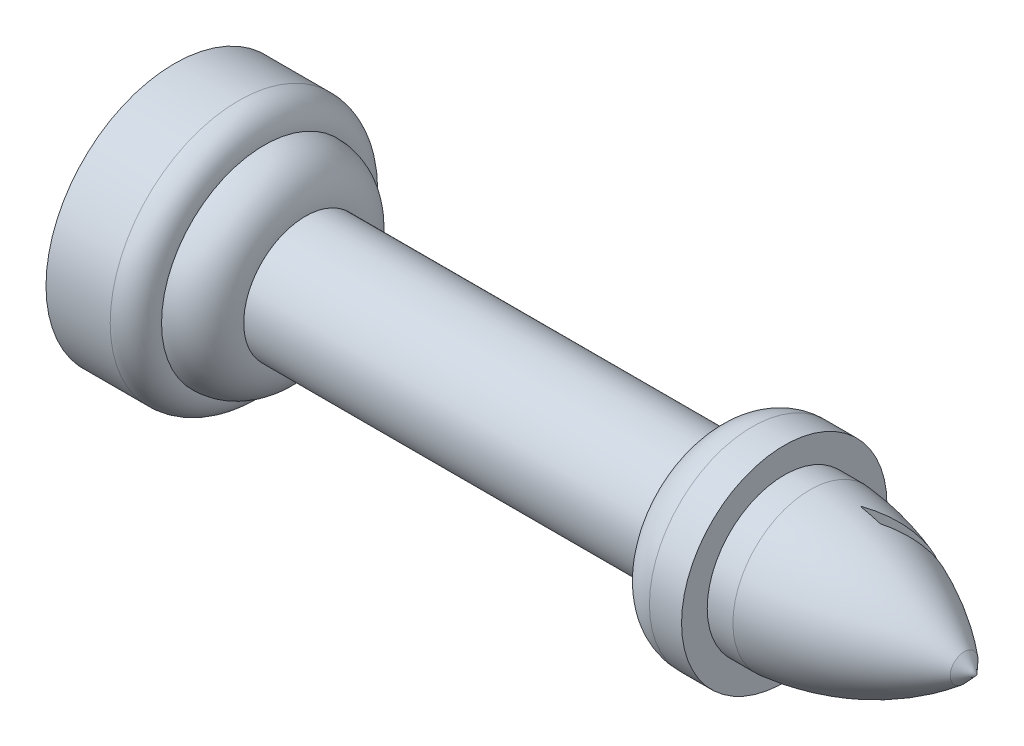
ISO-10303-21;
HEADER;
FILE_DESCRIPTION(('STEP AP214'),'2;1');
FILE_NAME('part.step','',(''),(''),'','','');
FILE_SCHEMA(('AUTOMOTIVE_DESIGN { 1 0 10303 214 1 1 1 1 }'));
ENDSEC;
DATA;
#1=APPLICATION_CONTEXT('core data for automotive mechanical design processes');
#2=APPLICATION_PROTOCOL_DEFINITION('international standard','automotive_design',2000,#1);
#3=PRODUCT_CONTEXT('',#1,'mechanical');
#4=PRODUCT('Part','Part','',(#3));
#5=PRODUCT_RELATED_PRODUCT_CATEGORY('part','',(#4));
#6=PRODUCT_DEFINITION_FORMATION('','',#4);
#7=PRODUCT_DEFINITION_CONTEXT('part definition',#1,'design');
#8=PRODUCT_DEFINITION('design','',#6,#7);
#9=PRODUCT_DEFINITION_SHAPE('','',#8);
#10=(LENGTH_UNIT() NAMED_UNIT(*) SI_UNIT(.MILLI.,.METRE.));
#11=(NAMED_UNIT(*) PLANE_ANGLE_UNIT() SI_UNIT($,.RADIAN.));
#12=(NAMED_UNIT(*) SI_UNIT($,.STERADIAN.) SOLID_ANGLE_UNIT());
#13=UNCERTAINTY_MEASURE_WITH_UNIT(LENGTH_MEASURE(1.E-05),#10,'distance_accuracy_value','');
#14=(GEOMETRIC_REPRESENTATION_CONTEXT(3) GLOBAL_UNCERTAINTY_ASSIGNED_CONTEXT((#13)) GLOBAL_UNIT_ASSIGNED_CONTEXT((#10,
#11,#12)) REPRESENTATION_CONTEXT('',''));
#15=CARTESIAN_POINT('',(0.,0.,0.));
#16=DIRECTION('',(0.,0.,1.));
#17=DIRECTION('',(1.,0.,0.));
#18=AXIS2_PLACEMENT_3D('',#15,#16,#17);
#19=CARTESIAN_POINT('',(0.,0.,0.));
#20=DIRECTION('',(-1.,0.,0.));
#21=DIRECTION('',(0.,0.,1.));
#22=AXIS2_PLACEMENT_3D('',#19,#20,#21);
#23=PLANE('',#22);
#24=CARTESIAN_POINT('',(0.,0.,0.));
#25=DIRECTION('',(-1.,0.,0.));
#26=DIRECTION('',(0.,0.,1.));
#27=AXIS2_PLACEMENT_3D('',#24,#25,#26);
#28=CIRCLE('',#27,10.);
#29=CARTESIAN_POINT('',(0.,0.,10.));
#30=VERTEX_POINT('',#29);
#31=EDGE_CURVE('E79',#30,#30,#28,.T.);
#32=ORIENTED_EDGE('',*,*,#31,.T.);
#33=EDGE_LOOP('',(#32));
#34=FACE_BOUND('',#33,.T.);
#35=ADVANCED_FACE('F56',(#34),#23,.T.);
#36=CARTESIAN_POINT('',(10.2,0.,0.));
#37=DIRECTION('',(1.,0.,0.));
#38=DIRECTION('',(0.,0.,-1.));
#39=AXIS2_PLACEMENT_3D('',#36,#37,#38);
#40=PLANE('',#39);
#41=CARTESIAN_POINT('',(10.2,0.,0.));
#42=DIRECTION('',(-1.,0.,0.));
#43=DIRECTION('',(0.,0.,1.));
#44=AXIS2_PLACEMENT_3D('',#41,#42,#43);
#45=CIRCLE('',#44,4.8);
#46=CARTESIAN_POINT('',(10.2,0.,4.8));
#47=VERTEX_POINT('',#46);
#48=EDGE_CURVE('E67',#47,#47,#45,.T.);
#49=ORIENTED_EDGE('',*,*,#48,.F.);
#50=EDGE_LOOP('',(#49));
#51=FACE_BOUND('',#50,.T.);
#52=ADVANCED_FACE('F97',(#51),#40,.T.);
#53=CARTESIAN_POINT('',(7.,0.,0.));
#54=DIRECTION('',(-1.,0.,0.));
#55=DIRECTION('',(0.,0.,1.));
#56=AXIS2_PLACEMENT_3D('',#53,#54,#55);
#57=TOROIDAL_SURFACE('',#56,4.8,3.2);
#58=ORIENTED_EDGE('',*,*,#48,.T.);
#59=EDGE_LOOP('',(#58));
#60=FACE_BOUND('',#59,.T.);
#61=CARTESIAN_POINT('',(7.,0.,0.));
#62=DIRECTION('',(-1.,0.,0.));
#63=DIRECTION('',(0.,0.,1.));
#64=AXIS2_PLACEMENT_3D('',#61,#62,#63);
#65=CIRCLE('',#64,8.);
#66=CARTESIAN_POINT('',(7.,0.,8.));
#67=VERTEX_POINT('',#66);
#68=EDGE_CURVE('E71',#67,#67,#65,.T.);
#69=ORIENTED_EDGE('',*,*,#68,.F.);
#70=EDGE_LOOP('',(#69));
#71=FACE_BOUND('',#70,.T.);
#72=ADVANCED_FACE('F93',(#60,#71),#57,.T.);
#73=CARTESIAN_POINT('',(5.,0.,0.));
#74=DIRECTION('',(-1.,0.,0.));
#75=DIRECTION('',(0.,0.,1.));
#76=AXIS2_PLACEMENT_3D('',#73,#74,#75);
#77=TOROIDAL_SURFACE('',#76,8.,2.);
#78=ORIENTED_EDGE('',*,*,#68,.T.);
#79=EDGE_LOOP('',(#78));
#80=FACE_BOUND('',#79,.T.);
#81=CARTESIAN_POINT('',(5.,0.,0.));
#82=DIRECTION('',(-1.,0.,0.));
#83=DIRECTION('',(0.,0.,1.));
#84=AXIS2_PLACEMENT_3D('',#81,#82,#83);
#85=CIRCLE('',#84,10.);
#86=CARTESIAN_POINT('',(5.,0.,10.));
#87=VERTEX_POINT('',#86);
#88=EDGE_CURVE('E76',#87,#87,#85,.T.);
#89=ORIENTED_EDGE('',*,*,#88,.F.);
#90=EDGE_LOOP('',(#89));
#91=FACE_BOUND('',#90,.T.);
#92=ADVANCED_FACE('F86',(#80,#91),#77,.T.);
#93=CARTESIAN_POINT('',(0.,0.,0.));
#94=DIRECTION('',(-1.,0.,0.));
#95=DIRECTION('',(0.,0.,1.));
#96=AXIS2_PLACEMENT_3D('',#93,#94,#95);
#97=CYLINDRICAL_SURFACE('',#96,10.);
#98=ORIENTED_EDGE('',*,*,#88,.T.);
#99=EDGE_LOOP('',(#98));
#100=FACE_BOUND('',#99,.T.);
#101=ORIENTED_EDGE('',*,*,#31,.F.);
#102=EDGE_LOOP('',(#101));
#103=FACE_BOUND('',#102,.T.);
#104=ADVANCED_FACE('F84',(#100,#103),#97,.T.);
#105=CLOSED_SHELL('',(#35,#52,#72,#92,#104));
#106=CARTESIAN_POINT('',(1.,0.,0.));
#107=DIRECTION('',(1.,0.,0.));
#108=DIRECTION('',(0.,0.,-1.));
#109=AXIS2_PLACEMENT_3D('',#106,#107,#108);
#110=PLANE('',#109);
#111=CARTESIAN_POINT('',(1.,0.,0.));
#112=DIRECTION('',(-1.,0.,0.));
#113=DIRECTION('',(0.,0.,1.));
#114=AXIS2_PLACEMENT_3D('',#111,#112,#113);
#115=CIRCLE('',#114,5.25);
#116=CARTESIAN_POINT('',(1.,0.,5.25));
#117=VERTEX_POINT('',#116);
#118=EDGE_CURVE('E11',#117,#117,#115,.T.);
#119=ORIENTED_EDGE('',*,*,#118,.F.);
#120=EDGE_LOOP('',(#119));
#121=FACE_BOUND('',#120,.T.);
#122=ADVANCED_FACE('F116',(#121),#110,.T.);
#123=CARTESIAN_POINT('',(0.,0.,0.));
#124=DIRECTION('',(-1.,0.,0.));
#125=DIRECTION('',(0.,0.,1.));
#126=AXIS2_PLACEMENT_3D('',#123,#124,#125);
#127=CYLINDRICAL_SURFACE('',#126,5.25);
#128=CARTESIAN_POINT('',(3.5,0.,0.));
#129=DIRECTION('',(-1.,0.,0.));
#130=DIRECTION('',(0.,0.,1.));
#131=AXIS2_PLACEMENT_3D('',#128,#129,#130);
#132=CIRCLE('',#131,5.25);
#133=CARTESIAN_POINT('',(3.5,0.,5.25));
#134=VERTEX_POINT('',#133);
#135=EDGE_CURVE('E63',#134,#134,#132,.T.);
#136=ORIENTED_EDGE('',*,*,#135,.F.);
#137=EDGE_LOOP('',(#136));
#138=FACE_BOUND('',#137,.T.);
#139=ORIENTED_EDGE('',*,*,#118,.T.);
#140=EDGE_LOOP('',(#139));
#141=FACE_BOUND('',#140,.T.);
#142=ADVANCED_FACE('F113',(#138,#141),#127,.F.);
#143=CARTESIAN_POINT('',(3.5,0.,0.));
#144=DIRECTION('',(1.,0.,0.));
#145=DIRECTION('',(0.,0.,-1.));
#146=AXIS2_PLACEMENT_3D('',#143,#144,#145);
#147=PLANE('',#146);
#148=ORIENTED_EDGE('',*,*,#135,.T.);
#149=EDGE_LOOP('',(#148));
#150=FACE_BOUND('',#149,.T.);
#151=ADVANCED_FACE('F110',(#150),#147,.F.);
#152=CLOSED_SHELL('',(#122,#142,#151));
#153=ORIENTED_CLOSED_SHELL('',*,#152,.T.);
#154=BREP_WITH_VOIDS('B2',#105,(#153));
#155=CARTESIAN_POINT('',(47.5385813618962,0.,0.));
#156=DIRECTION('',(-1.,0.,0.));
#157=DIRECTION('',(0.,0.,1.));
#158=AXIS2_PLACEMENT_3D('',#155,#156,#157);
#159=DEGENERATE_TOROIDAL_SURFACE('',#158,15.9123900322648,22.,.F.);
#160=CARTESIAN_POINT('',(61.5089202758048,0.,0.));
#161=DIRECTION('',(-1.,0.,0.));
#162=DIRECTION('',(0.,0.,1.));
#163=AXIS2_PLACEMENT_3D('',#160,#161,#162);
#164=CIRCLE('',#163,1.08259836521673);
#165=CARTESIAN_POINT('',(61.5089202758048,0.,1.08259836521673));
#166=VERTEX_POINT('',#165);
#167=EDGE_CURVE('E253',#166,#166,#164,.T.);
#168=ORIENTED_EDGE('',*,*,#167,.T.);
#169=EDGE_LOOP('',(#168));
#170=FACE_BOUND('',#169,.T.);
#171=CARTESIAN_POINT('',(49.5,0.,0.));
#172=DIRECTION('',(-1.,0.,0.));
#173=DIRECTION('',(0.,0.,1.));
#174=AXIS2_PLACEMENT_3D('',#171,#172,#173);
#175=CIRCLE('',#174,6.);
#176=CARTESIAN_POINT('',(49.5,0.,6.));
#177=VERTEX_POINT('',#176);
#178=EDGE_CURVE('E249',#177,#177,#175,.T.);
#179=ORIENTED_EDGE('',*,*,#178,.F.);
#180=EDGE_LOOP('',(#179));
#181=FACE_BOUND('',#180,.T.);
#182=CARTESIAN_POINT('',(53.5998,-5.04559663815738,-1.3998));
#183=CARTESIAN_POINT('',(53.740632538585,-4.96461744035388,-1.54063253858498));
#184=CARTESIAN_POINT('',(53.8793138299198,-4.87597037100424,-1.67931382991983));
#185=CARTESIAN_POINT('',(54.1514033005694,-4.6829902542954,-1.95140330056942));
#186=CARTESIAN_POINT('',(54.2848017737787,-4.57862988528482,-2.08480177377869));
#187=CARTESIAN_POINT('',(54.5460158578433,-4.35315097550047,-2.34601585784325));
#188=CARTESIAN_POINT('',(54.6737707419574,-4.23189066933842,-2.47377074195736));
#189=CARTESIAN_POINT('',(54.9207369467646,-3.97338887498967,-2.72073694676457));
#190=CARTESIAN_POINT('',(55.0399549287112,-3.83616007127216,-2.83995492871115));
#191=CARTESIAN_POINT('',(55.3176826857856,-3.48257286960893,-3.1176826857856));
#192=CARTESIAN_POINT('',(55.4709077331819,-3.25764677093346,-3.27090773318187));
#193=CARTESIAN_POINT('',(55.679928729032,-2.89697904156231,-3.47992872903201));
#194=CARTESIAN_POINT('',(55.7460743553597,-2.77301912645515,-3.54607435535971));
#195=CARTESIAN_POINT('',(55.870650214328,-2.51760502907273,-3.67065021432794));
#196=CARTESIAN_POINT('',(55.9290850152658,-2.38615535082735,-3.72908501526581));
#197=CARTESIAN_POINT('',(56.0287992559095,-2.13753426586826,-3.82879925590947));
#198=CARTESIAN_POINT('',(56.0713315600788,-2.02136504803485,-3.87133156007874));
#199=CARTESIAN_POINT('',(56.1496740501591,-1.78462514577908,-3.9496740501591));
#200=CARTESIAN_POINT('',(56.1854874363421,-1.66405658965101,-3.98548743634203));
#201=CARTESIAN_POINT('',(56.2498319696242,-1.41924669966921,-4.04983196962415));
#202=CARTESIAN_POINT('',(56.278371766074,-1.29500992597865,-4.078371766074));
#203=CARTESIAN_POINT('',(56.3277358549211,-1.04354920513903,-4.12773585492108));
#204=CARTESIAN_POINT('',(56.348563168578,-0.916326448520872,-4.148563168578));
#205=CARTESIAN_POINT('',(56.3823476266928,-0.658142909482095,-4.18234762669272));
#206=CARTESIAN_POINT('',(56.3952024896906,-0.527155237877603,-4.1952024896906));
#207=CARTESIAN_POINT('',(56.4123704293597,-0.264044155482028,-4.21237042935969));
#208=CARTESIAN_POINT('',(56.4166825046797,-0.131920613371543,-4.21668250467969));
#209=CARTESIAN_POINT('',(56.4166743265942,0.127866872715145,-4.21667432659417));
#210=CARTESIAN_POINT('',(56.4126401660474,0.255531010816876,-4.21264016604736));
#211=CARTESIAN_POINT('',(56.3965868205671,0.509896994910069,-4.19658682056708));
#212=CARTESIAN_POINT('',(56.3845646420125,0.636598462115161,-4.18456464201248));
#213=CARTESIAN_POINT('',(56.3527385981617,0.888169864168006,-4.15273859816162));
#214=CARTESIAN_POINT('',(56.3329260646022,1.01303759753157,-4.13292606460217));
#215=CARTESIAN_POINT('',(56.2858607724852,1.25998061327954,-4.08586077248512));
#216=CARTESIAN_POINT('',(56.2586050050042,1.38205474467559,-4.05860500500413));
#217=CARTESIAN_POINT('',(56.1981107722346,1.6186641946828,-3.99811077223457));
#218=CARTESIAN_POINT('',(56.1650982738978,1.73331542892543,-3.96509827389782));
#219=CARTESIAN_POINT('',(56.0929839447897,1.95873862778626,-3.8929839447897));
#220=CARTESIAN_POINT('',(56.053880164429,2.06950933644253,-3.85388016442893));
#221=CARTESIAN_POINT('',(55.9281967904979,2.39518105704538,-3.72819679049785));
#222=CARTESIAN_POINT('',(55.8331888402263,2.60365698012364,-3.63318884022632));
#223=CARTESIAN_POINT('',(55.5811298007102,3.08367198006086,-3.38112980071015));
#224=CARTESIAN_POINT('',(55.4147144270171,3.34534159700498,-3.21471442701709));
#225=CARTESIAN_POINT('',(55.0537767786817,3.82737163723963,-2.85377677868172));
#226=CARTESIAN_POINT('',(54.8591717435336,4.04760587671502,-2.65917174353362));
#227=CARTESIAN_POINT('',(54.4891976688062,4.40749498996761,-2.28919766880616));
#228=CARTESIAN_POINT('',(54.3173532755238,4.554499090957,-2.1173532755238));
#229=CARTESIAN_POINT('',(54.0526492790423,4.75419311958484,-1.85264927904233));
#230=CARTESIAN_POINT('',(53.9635743296895,4.81710926766659,-1.76357432968953));
#231=CARTESIAN_POINT('',(53.7832498560792,4.9363067287813,-1.58324985607921));
#232=CARTESIAN_POINT('',(53.6920007284111,4.99258924087732,-1.49200072841105));
#233=CARTESIAN_POINT('',(53.5998,5.04559663815738,-1.3998));
#234=B_SPLINE_CURVE_WITH_KNOTS('',3,(#182,#183,#184,#185,#186,#187,#188,#189,#190,#191,#192,
#193,#194,#195,#196,#197,#198,#199,#200,#201,#202,#203,#204,#205,#206,#207,#208,#209,#210,#211,
#212,#213,#214,#215,#216,#217,#218,#219,#220,#221,#222,#223,#224,#225,#226,#227,#228,#229,#230,
#231,#232,#233),.UNSPECIFIED.,.F.,.F.,(4,2,2,2,2,2,2,2,2,2,2,2,2,2,2,2,2,2,2,2,2,2,2,2,2,4),(0.,
0.644943328594269,1.2910212927742,1.94288769833727,2.59423978817865,3.52707660746896,
3.99251794759135,4.45768228579804,4.84975083333019,5.24163215886048,5.63304528327781,
6.02430491434202,6.42048559761686,6.81671271685175,7.19958315551219,7.58259716120033,
7.96603855490053,8.34963518462493,8.72062952925236,9.09174286006659,9.83328776720735,
10.8834880728053,11.9368365596569,12.7871085376092,13.2093695050074,13.6315540291772),.UNSPECIFIED.);
#235=CARTESIAN_POINT('',(53.6,-5.0454816607392,-1.4));
#236=VERTEX_POINT('',#235);
#237=CARTESIAN_POINT('',(53.6,5.04548166073921,-1.4));
#238=VERTEX_POINT('',#237);
#239=EDGE_CURVE('E53',#236,#238,#234,.T.);
#240=ORIENTED_EDGE('',*,*,#239,.T.);
#241=CARTESIAN_POINT('',(45.790130121496,5.85291158924615,-1.4));
#242=CARTESIAN_POINT('',(46.3859643088266,5.90179298545365,-1.4));
#243=CARTESIAN_POINT('',(46.9838469809245,5.92561060385282,-1.4));
#244=CARTESIAN_POINT('',(48.1797108378641,5.9231832180913,-1.4));
#245=CARTESIAN_POINT('',(48.777691989141,5.89692152862758,-1.4));
#246=CARTESIAN_POINT('',(49.9751113959396,5.79387228268547,-1.4));
#247=CARTESIAN_POINT('',(50.5745078577141,5.71659875819626,-1.4));
#248=CARTESIAN_POINT('',(51.7644233793324,5.51137985215925,-1.4));
#249=CARTESIAN_POINT('',(52.3549449715176,5.38344922132785,-1.4));
#250=CARTESIAN_POINT('',(53.41567269452,5.1054088308677,-1.4));
#251=CARTESIAN_POINT('',(53.888087926103,4.9636656000698,-1.4));
#252=CARTESIAN_POINT('',(54.8216891495054,4.64678800622379,-1.4));
#253=CARTESIAN_POINT('',(55.2828733500005,4.4716483553506,-1.4));
#254=CARTESIAN_POINT('',(56.1888765458052,4.08886297734791,-1.4));
#255=CARTESIAN_POINT('',(56.6337671957642,3.88138813838904,-1.4));
#256=CARTESIAN_POINT('',(57.2877826750102,3.54474003565014,-1.4));
#257=CARTESIAN_POINT('',(57.5035341274635,3.42830546174042,-1.4));
#258=CARTESIAN_POINT('',(57.9300315079496,3.18662629421123,-1.4));
#259=CARTESIAN_POINT('',(58.1407782914214,3.06138322092375,-1.4));
#260=CARTESIAN_POINT('',(58.4756720166858,2.85200151575327,-1.4));
#261=CARTESIAN_POINT('',(58.6016585803206,2.77079406219752,-1.4));
#262=CARTESIAN_POINT('',(58.8511213092228,2.60467141233975,-1.4));
#263=CARTESIAN_POINT('',(58.9745981315889,2.51975720535244,-1.4));
#264=CARTESIAN_POINT('',(59.2187961401359,2.34579878830223,-1.4));
#265=CARTESIAN_POINT('',(59.3395146222455,2.25675076486276,-1.4));
#266=CARTESIAN_POINT('',(59.5179975175383,2.11974074441995,-1.4));
#267=CARTESIAN_POINT('',(59.5770745178954,2.07348514089237,-1.4));
#268=CARTESIAN_POINT('',(59.6942420942941,1.9797320980815,-1.4));
#269=CARTESIAN_POINT('',(59.7523325886546,1.93223455678673,-1.4));
#270=CARTESIAN_POINT('',(59.809869878504,1.88406852351322,-1.4));
#271=B_SPLINE_CURVE_WITH_KNOTS('',3,(#241,#242,#243,#244,#245,#246,#247,#248,#249,#250,#251,
#252,#253,#254,#255,#256,#257,#258,#259,#260,#261,#262,#263,#264,#265,#266,#267,#268,#269,#270),
.UNSPECIFIED.,.F.,.F.,(4,2,2,2,2,2,2,2,2,2,2,2,2,2,4),(0.,1.79297480141586,3.58654708622738,
5.39745742669922,7.20784084002296,8.68630845393271,10.1650103558127,11.6361470862089,
12.3714789917142,13.1066842901834,13.5563011166797,14.0057986676436,14.4557194486893,
14.6807980868746,14.905895271222),.UNSPECIFIED.);
#272=CARTESIAN_POINT('',(52.,5.4536624644417,-1.4));
#273=VERTEX_POINT('',#272);
#274=EDGE_CURVE('E203',#273,#238,#271,.T.);
#275=ORIENTED_EDGE('',*,*,#274,.F.);
#276=CARTESIAN_POINT('',(51.9998,5.45375656268824,-1.3998));
#277=CARTESIAN_POINT('',(52.1318805193949,5.39160662925254,-1.53188051939487));
#278=CARTESIAN_POINT('',(52.262509842621,5.3231960551115,-1.66250984262094));
#279=CARTESIAN_POINT('',(52.520198669703,5.17367747133408,-1.92019866970294));
#280=CARTESIAN_POINT('',(52.6472552823338,5.09255950828793,-2.04725528233378));
#281=CARTESIAN_POINT('',(52.8978665659849,4.91688455596901,-2.29786656598484));
#282=CARTESIAN_POINT('',(53.0213874158811,4.82223041318343,-2.42138741588111));
#283=CARTESIAN_POINT('',(53.2629011062798,4.61994100822439,-2.66290110627979));
#284=CARTESIAN_POINT('',(53.3808955323877,4.51230950150402,-2.78089553238763));
#285=CARTESIAN_POINT('',(53.7008794522632,4.19383898583947,-3.10087945226315));
#286=CARTESIAN_POINT('',(53.8959030481694,3.96843143429378,-3.29590304816937));
#287=CARTESIAN_POINT('',(54.1669918138388,3.59980992615871,-3.56699181383873));
#288=CARTESIAN_POINT('',(54.2537200370429,3.47196442888953,-3.65372003704283));
#289=CARTESIAN_POINT('',(54.4191000569637,3.20625876645027,-3.81910005696365));
#290=CARTESIAN_POINT('',(54.497756952755,3.0684050191901,-3.89775695275497));
#291=CARTESIAN_POINT('',(54.6325085608353,2.80882343591394,-4.03250856083522));
#292=CARTESIAN_POINT('',(54.6901157332026,2.6886608494343,-4.09011573320258));
#293=CARTESIAN_POINT('',(54.798439384807,2.44232792071441,-4.19843938480693));
#294=CARTESIAN_POINT('',(54.8491591097035,2.31616044635497,-4.24915910970345));
#295=CARTESIAN_POINT('',(54.9430219967814,2.05838316871435,-4.34302199678137));
#296=CARTESIAN_POINT('',(54.986169227219,1.92677633492731,-4.38616922721897));
#297=CARTESIAN_POINT('',(55.0642519371877,1.65877554867235,-4.46425193718771));
#298=CARTESIAN_POINT('',(55.0991887217141,1.52238236092946,-4.49918872171405));
#299=CARTESIAN_POINT('',(55.1543984125543,1.27223956587645,-4.55439841255428));
#300=CARTESIAN_POINT('',(55.1761984458667,1.15916030640624,-4.57619844586661));
#301=CARTESIAN_POINT('',(55.2137784448763,0.931022590050553,-4.6137784448763));
#302=CARTESIAN_POINT('',(55.229559105266,0.815964363159301,-4.62955910526596));
#303=CARTESIAN_POINT('',(55.2548992317702,0.58445348837053,-4.65489923177016));
#304=CARTESIAN_POINT('',(55.2644571992321,0.468000511438128,-4.66445719923209));
#305=CARTESIAN_POINT('',(55.2772163862687,0.234435950078582,-4.67721638626866));
#306=CARTESIAN_POINT('',(55.280419290621,0.117324548463618,-4.68041929062097));
#307=CARTESIAN_POINT('',(55.2804252565972,-0.147546355090779,-4.68042525659714));
#308=CARTESIAN_POINT('',(55.2753361693105,-0.295313630069571,-4.67533616931048));
#309=CARTESIAN_POINT('',(55.2550775051763,-0.589473692555296,-4.65507750517624));
#310=CARTESIAN_POINT('',(55.2399058514476,-0.735866190573639,-4.63990585144754));
#311=CARTESIAN_POINT('',(55.1997906876714,-1.02604786914479,-4.59979068767132));
#312=CARTESIAN_POINT('',(55.17484023796,-1.16983512486599,-4.57484023795993));
#313=CARTESIAN_POINT('',(55.1156692316017,-1.4535155606942,-4.5156692316017));
#314=CARTESIAN_POINT('',(55.081449493251,-1.59340908333974,-4.48144949325094));
#315=CARTESIAN_POINT('',(55.008641835645,-1.85307811336005,-4.40864183564493));
#316=CARTESIAN_POINT('',(54.9709592328034,-1.97336416370476,-4.37095923280337));
#317=CARTESIAN_POINT('',(54.8892513059155,-2.20955457003663,-4.2892513059155));
#318=CARTESIAN_POINT('',(54.8452241783789,-2.32545766826232,-4.24522417837891));
#319=CARTESIAN_POINT('',(54.7044295394678,-2.66576032900678,-4.10442953946781));
#320=CARTESIAN_POINT('',(54.5988697774157,-2.88302928221532,-3.99886977741563));
#321=CARTESIAN_POINT('',(54.4025326590893,-3.23481719836507,-3.80253265908925));
#322=CARTESIAN_POINT('',(54.3165693986934,-3.37485050810842,-3.71656939869332));
#323=CARTESIAN_POINT('',(54.1363170734316,-3.6438255553463,-3.5363170734316));
#324=CARTESIAN_POINT('',(54.0420250809193,-3.77276336094735,-3.44202508091928));
#325=CARTESIAN_POINT('',(53.7479184102857,-4.14316818907247,-3.14791841028568));
#326=CARTESIAN_POINT('',(53.5372343842034,-4.36759499207152,-2.93723438420339));
#327=CARTESIAN_POINT('',(53.1106242389098,-4.75631648543707,-2.51062423890976));
#328=CARTESIAN_POINT('',(52.8960832134277,-4.92370892472267,-2.2960832134277));
#329=CARTESIAN_POINT('',(52.5654128391971,-5.14479735055202,-1.96541283919705));
#330=CARTESIAN_POINT('',(52.4541195402645,-5.21330460943137,-1.85411954026449));
#331=CARTESIAN_POINT('',(52.2288606435526,-5.34070463515223,-1.62886064355259));
#332=CARTESIAN_POINT('',(52.11489606488,-5.39960100245853,-1.51489606488));
#333=CARTESIAN_POINT('',(51.9998,-5.45375656268824,-1.3998));
#334=B_SPLINE_CURVE_WITH_KNOTS('',3,(#276,#277,#278,#279,#280,#281,#282,#283,#284,#285,#286,
#287,#288,#289,#290,#291,#292,#293,#294,#295,#296,#297,#298,#299,#300,#301,#302,#303,#304,#305,
#306,#307,#308,#309,#310,#311,#312,#313,#314,#315,#316,#317,#318,#319,#320,#321,#322,#323,#324,
#325,#326,#327,#328,#329,#330,#331,#332,#333),.UNSPECIFIED.,.F.,.F.,(4,2,2,2,2,2,2,2,2,2,2,2,2,
2,2,2,2,2,2,2,2,2,2,2,2,2,2,2,4),(0.,0.590503360352431,1.18147158284266,1.7769167520655,
2.37219002016335,3.43587269058999,3.96687305555958,4.49753586770282,4.93265637571865,
5.36757111946678,5.80225148903368,6.23686272227897,6.58817622402647,6.93944916861267,
7.29080668133806,7.64207103394499,8.08517223221444,8.52836473202628,8.97187232096059,
9.41534076964084,9.8096277110288,10.2040269540551,10.9919407254943,11.5476096863713,
12.1034747546477,13.2176112689601,14.2542149398311,14.768910244936,15.2834122882745),.UNSPECIFIED.);
#335=CARTESIAN_POINT('',(52.,-5.45366246444598,-1.4));
#336=VERTEX_POINT('',#335);
#337=EDGE_CURVE('E238',#273,#336,#334,.T.);
#338=ORIENTED_EDGE('',*,*,#337,.T.);
#339=CARTESIAN_POINT('',(45.790130121496,-5.85291158924615,-1.4));
#340=CARTESIAN_POINT('',(46.3859643088266,-5.90179298545365,-1.4));
#341=CARTESIAN_POINT('',(46.9838469809245,-5.92561060385282,-1.4));
#342=CARTESIAN_POINT('',(48.1797108378641,-5.9231832180913,-1.4));
#343=CARTESIAN_POINT('',(48.777691989141,-5.89692152862758,-1.4));
#344=CARTESIAN_POINT('',(49.9751113959396,-5.79387228268546,-1.4));
#345=CARTESIAN_POINT('',(50.5745078577141,-5.71659875819626,-1.4));
#346=CARTESIAN_POINT('',(51.7644233793324,-5.51137985215925,-1.4));
#347=CARTESIAN_POINT('',(52.3549449715176,-5.38344922132785,-1.4));
#348=CARTESIAN_POINT('',(53.41567269452,-5.1054088308677,-1.4));
#349=CARTESIAN_POINT('',(53.888087926103,-4.9636656000698,-1.4));
#350=CARTESIAN_POINT('',(54.8216891495054,-4.64678800622379,-1.4));
#351=CARTESIAN_POINT('',(55.2828733500005,-4.4716483553506,-1.4));
#352=CARTESIAN_POINT('',(56.1888765458052,-4.08886297734791,-1.4));
#353=CARTESIAN_POINT('',(56.6337671957642,-3.88138813838903,-1.4));
#354=CARTESIAN_POINT('',(57.2877826750102,-3.54474003565014,-1.4));
#355=CARTESIAN_POINT('',(57.5035341274635,-3.42830546174042,-1.4));
#356=CARTESIAN_POINT('',(57.9300315079496,-3.18662629421124,-1.4));
#357=CARTESIAN_POINT('',(58.1407782914214,-3.06138322092376,-1.4));
#358=CARTESIAN_POINT('',(58.4756720166857,-2.85200151575327,-1.4));
#359=CARTESIAN_POINT('',(58.6016585803206,-2.77079406219752,-1.4));
#360=CARTESIAN_POINT('',(58.8511213092228,-2.60467141233976,-1.4));
#361=CARTESIAN_POINT('',(58.9745981315889,-2.51975720535244,-1.4));
#362=CARTESIAN_POINT('',(59.2187961401359,-2.34579878830223,-1.4));
#363=CARTESIAN_POINT('',(59.3395146222455,-2.25675076486276,-1.4));
#364=CARTESIAN_POINT('',(59.5179975175383,-2.11974074441995,-1.4));
#365=CARTESIAN_POINT('',(59.5770745178955,-2.07348514089237,-1.4));
#366=CARTESIAN_POINT('',(59.6942420942941,-1.97973209808149,-1.4));
#367=CARTESIAN_POINT('',(59.7523325886546,-1.93223455678673,-1.4));
#368=CARTESIAN_POINT('',(59.809869878504,-1.88406852351321,-1.4));
#369=B_SPLINE_CURVE_WITH_KNOTS('',3,(#339,#340,#341,#342,#343,#344,#345,#346,#347,#348,#349,
#350,#351,#352,#353,#354,#355,#356,#357,#358,#359,#360,#361,#362,#363,#364,#365,#366,#367,#368),
.UNSPECIFIED.,.F.,.F.,(4,2,2,2,2,2,2,2,2,2,2,2,2,2,4),(0.,1.79297480141586,3.58654708622738,
5.39745742669922,7.20784084002296,8.68630845393271,10.1650103558127,11.6361470862089,
12.3714789917142,13.1066842901834,13.5563011166797,14.0057986676436,14.4557194486893,
14.6807980868746,14.905895271222),.UNSPECIFIED.);
#370=EDGE_CURVE('E182',#336,#236,#369,.T.);
#371=ORIENTED_EDGE('',*,*,#370,.T.);
#372=EDGE_LOOP('',(#240,#275,#338,#371));
#373=FACE_BOUND('',#372,.T.);
#374=ADVANCED_FACE('F168',(#170,#181,#373),#159,.F.);
#375=CARTESIAN_POINT('',(47.5,0.,0.));
#376=DIRECTION('',(-1.,0.,0.));
#377=DIRECTION('',(0.,0.,1.));
#378=AXIS2_PLACEMENT_3D('',#375,#376,#377);
#379=CYLINDRICAL_SURFACE('',#378,6.);
#380=CARTESIAN_POINT('',(47.5,0.,0.));
#381=DIRECTION('',(-1.,0.,0.));
#382=DIRECTION('',(0.,0.,1.));
#383=AXIS2_PLACEMENT_3D('',#380,#381,#382);
#384=CIRCLE('',#383,6.);
#385=CARTESIAN_POINT('',(47.5,0.,6.));
#386=VERTEX_POINT('',#385);
#387=EDGE_CURVE('E245',#386,#386,#384,.T.);
#388=ORIENTED_EDGE('',*,*,#387,.F.);
#389=EDGE_LOOP('',(#388));
#390=FACE_BOUND('',#389,.T.);
#391=ORIENTED_EDGE('',*,*,#178,.T.);
#392=EDGE_LOOP('',(#391));
#393=FACE_BOUND('',#392,.T.);
#394=ADVANCED_FACE('F170',(#390,#393),#379,.T.);
#395=CARTESIAN_POINT('',(62.5,0.,0.));
#396=DIRECTION('',(-1.,0.,0.));
#397=DIRECTION('',(0.,0.,1.));
#398=AXIS2_PLACEMENT_3D('',#395,#396,#397);
#399=CONICAL_SURFACE('',#398,0.,0.829503028039781);
#400=ORIENTED_EDGE('',*,*,#167,.F.);
#401=EDGE_LOOP('',(#400));
#402=FACE_BOUND('',#401,.T.);
#403=CARTESIAN_POINT('',(62.5,0.,0.));
#404=VERTEX_POINT('',#403);
#405=VERTEX_LOOP('',#404);
#406=FACE_BOUND('',#405,.T.);
#407=ADVANCED_FACE('F278',(#402,#406),#399,.T.);
#408=CARTESIAN_POINT('',(10.2,0.,0.));
#409=DIRECTION('',(1.,0.,0.));
#410=DIRECTION('',(0.,0.,-1.));
#411=AXIS2_PLACEMENT_3D('',#408,#409,#410);
#412=PLANE('',#411);
#413=CARTESIAN_POINT('',(10.2,0.,0.));
#414=DIRECTION('',(1.,0.,0.));
#415=DIRECTION('',(0.,0.,-1.));
#416=AXIS2_PLACEMENT_3D('',#413,#414,#415);
#417=CIRCLE('',#416,4.8);
#418=CARTESIAN_POINT('',(10.2,0.,-4.8));
#419=VERTEX_POINT('',#418);
#420=EDGE_CURVE('E208',#419,#419,#417,.T.);
#421=ORIENTED_EDGE('',*,*,#420,.F.);
#422=EDGE_LOOP('',(#421));
#423=FACE_BOUND('',#422,.T.);
#424=ADVANCED_FACE('F275',(#423),#412,.F.);
#425=CARTESIAN_POINT('',(47.5,0.,0.));
#426=DIRECTION('',(-1.,0.,0.));
#427=DIRECTION('',(0.,0.,1.));
#428=AXIS2_PLACEMENT_3D('',#425,#426,#427);
#429=PLANE('',#428);
#430=ORIENTED_EDGE('',*,*,#387,.T.);
#431=EDGE_LOOP('',(#430));
#432=FACE_BOUND('',#431,.T.);
#433=CARTESIAN_POINT('',(47.5,0.,0.));
#434=DIRECTION('',(1.,0.,0.));
#435=DIRECTION('',(0.,0.,-1.));
#436=AXIS2_PLACEMENT_3D('',#433,#434,#435);
#437=CIRCLE('',#436,8.);
#438=CARTESIAN_POINT('',(47.5,0.,-8.));
#439=VERTEX_POINT('',#438);
#440=EDGE_CURVE('E257',#439,#439,#437,.T.);
#441=ORIENTED_EDGE('',*,*,#440,.T.);
#442=EDGE_LOOP('',(#441));
#443=FACE_BOUND('',#442,.T.);
#444=ADVANCED_FACE('F277',(#432,#443),#429,.F.);
#445=CARTESIAN_POINT('',(41.8,0.,0.));
#446=DIRECTION('',(1.,0.,0.));
#447=DIRECTION('',(0.,0.,-1.));
#448=AXIS2_PLACEMENT_3D('',#445,#446,#447);
#449=CYLINDRICAL_SURFACE('',#448,8.);
#450=ORIENTED_EDGE('',*,*,#440,.F.);
#451=EDGE_LOOP('',(#450));
#452=FACE_BOUND('',#451,.T.);
#453=CARTESIAN_POINT('',(45.,0.,0.));
#454=DIRECTION('',(1.,0.,0.));
#455=DIRECTION('',(0.,0.,-1.));
#456=AXIS2_PLACEMENT_3D('',#453,#454,#455);
#457=CIRCLE('',#456,8.);
#458=CARTESIAN_POINT('',(45.,0.,-8.));
#459=VERTEX_POINT('',#458);
#460=EDGE_CURVE('E261',#459,#459,#457,.T.);
#461=ORIENTED_EDGE('',*,*,#460,.T.);
#462=EDGE_LOOP('',(#461));
#463=FACE_BOUND('',#462,.T.);
#464=ADVANCED_FACE('F284',(#452,#463),#449,.T.);
#465=CARTESIAN_POINT('',(45.,0.,0.));
#466=DIRECTION('',(1.,0.,0.));
#467=DIRECTION('',(0.,0.,-1.));
#468=AXIS2_PLACEMENT_3D('',#465,#466,#467);
#469=TOROIDAL_SURFACE('',#468,4.8,3.2);
#470=ORIENTED_EDGE('',*,*,#460,.F.);
#471=EDGE_LOOP('',(#470));
#472=FACE_BOUND('',#471,.T.);
#473=CARTESIAN_POINT('',(41.8,0.,0.));
#474=DIRECTION('',(1.,0.,0.));
#475=DIRECTION('',(0.,0.,-1.));
#476=AXIS2_PLACEMENT_3D('',#473,#474,#475);
#477=CIRCLE('',#476,4.8);
#478=CARTESIAN_POINT('',(41.8,0.,-4.8));
#479=VERTEX_POINT('',#478);
#480=EDGE_CURVE('E265',#479,#479,#477,.T.);
#481=ORIENTED_EDGE('',*,*,#480,.T.);
#482=EDGE_LOOP('',(#481));
#483=FACE_BOUND('',#482,.T.);
#484=ADVANCED_FACE('F308',(#472,#483),#469,.T.);
#485=CARTESIAN_POINT('',(41.8,0.,0.));
#486=DIRECTION('',(1.,0.,0.));
#487=DIRECTION('',(0.,0.,-1.));
#488=AXIS2_PLACEMENT_3D('',#485,#486,#487);
#489=CYLINDRICAL_SURFACE('',#488,4.8);
#490=ORIENTED_EDGE('',*,*,#480,.F.);
#491=EDGE_LOOP('',(#490));
#492=FACE_BOUND('',#491,.T.);
#493=ORIENTED_EDGE('',*,*,#420,.T.);
#494=EDGE_LOOP('',(#493));
#495=FACE_BOUND('',#494,.T.);
#496=ADVANCED_FACE('F273',(#492,#495),#489,.T.);
#497=CARTESIAN_POINT('',(53.6,-10.,-1.4));
#498=DIRECTION('',(0.707106781186544,0.,0.707106781186551));
#499=DIRECTION('',(0.707106781186551,0.,-0.707106781186544));
#500=AXIS2_PLACEMENT_3D('',#497,#498,#499);
#501=PLANE('',#500);
#502=DIRECTION('',(0.,1.,0.));
#503=VECTOR('',#502,1.);
#504=CARTESIAN_POINT('',(53.6,-10.,-1.4));
#505=LINE('',#504,#503);
#506=EDGE_CURVE('E204',#236,#238,#505,.T.);
#507=ORIENTED_EDGE('',*,*,#506,.T.);
#508=ORIENTED_EDGE('',*,*,#239,.F.);
#509=EDGE_LOOP('',(#507,#508));
#510=FACE_BOUND('',#509,.T.);
#511=ADVANCED_FACE('F205',(#510),#501,.F.);
#512=CARTESIAN_POINT('',(53.6,-10.,-1.4));
#513=DIRECTION('',(0.,0.,1.));
#514=DIRECTION('',(1.,0.,0.));
#515=AXIS2_PLACEMENT_3D('',#512,#513,#514);
#516=PLANE('',#515);
#517=DIRECTION('',(0.,1.,0.));
#518=VECTOR('',#517,1.);
#519=CARTESIAN_POINT('',(52.,-10.,-1.4));
#520=LINE('',#519,#518);
#521=EDGE_CURVE('E209',#336,#273,#520,.T.);
#522=ORIENTED_EDGE('',*,*,#521,.T.);
#523=ORIENTED_EDGE('',*,*,#274,.T.);
#524=ORIENTED_EDGE('',*,*,#506,.F.);
#525=ORIENTED_EDGE('',*,*,#370,.F.);
#526=EDGE_LOOP('',(#522,#523,#524,#525));
#527=FACE_BOUND('',#526,.T.);
#528=ADVANCED_FACE('F212',(#527),#516,.F.);
#529=CARTESIAN_POINT('',(52.,-10.,-1.4));
#530=DIRECTION('',(-0.707106781186544,0.,-0.707106781186551));
#531=DIRECTION('',(-0.707106781186551,0.,0.707106781186544));
#532=AXIS2_PLACEMENT_3D('',#529,#530,#531);
#533=PLANE('',#532);
#534=ORIENTED_EDGE('',*,*,#337,.F.);
#535=ORIENTED_EDGE('',*,*,#521,.F.);
#536=EDGE_LOOP('',(#534,#535));
#537=FACE_BOUND('',#536,.T.);
#538=ADVANCED_FACE('F230',(#537),#533,.F.);
#539=CLOSED_SHELL('',(#374,#394,#407,#424,#444,#464,#484,#496,#511,#528,#538));
#540=MANIFOLD_SOLID_BREP('B6',#539);
#541=ADVANCED_BREP_SHAPE_REPRESENTATION('',(#18,#154,#540),#14);
#542=SHAPE_DEFINITION_REPRESENTATION(#9,#541);
ENDSEC;
END-ISO-10303-21;
